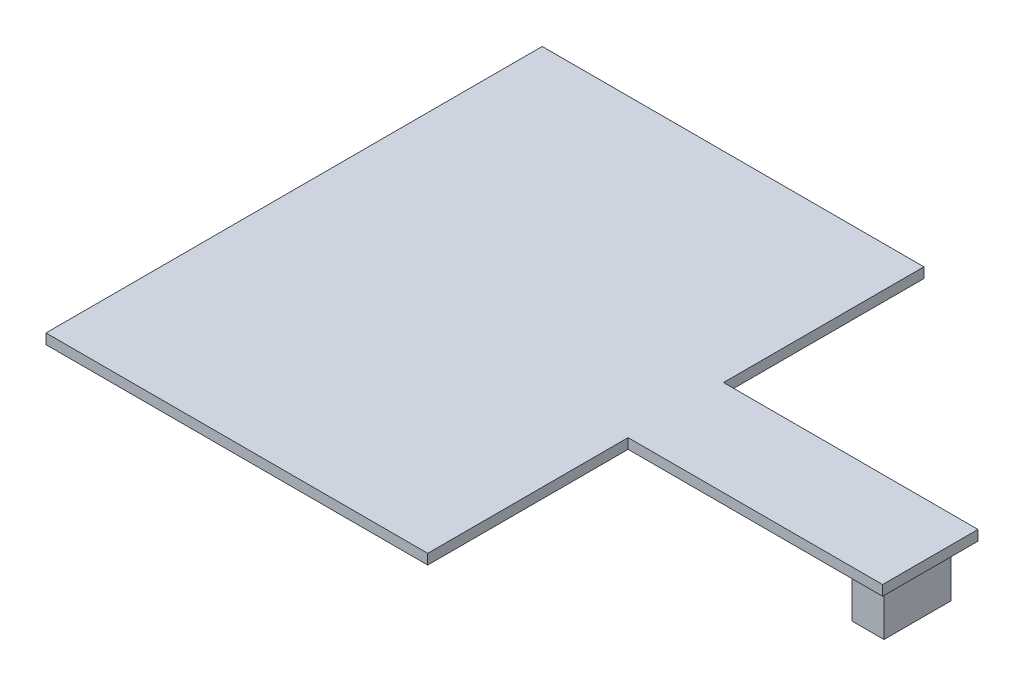
ISO-10303-21;
HEADER;
FILE_DESCRIPTION(('STEP AP214'),'2;1');
FILE_NAME('part.step','',(''),(''),'','','');
FILE_SCHEMA(('AUTOMOTIVE_DESIGN { 1 0 10303 214 1 1 1 1 }'));
ENDSEC;
DATA;
#1=APPLICATION_CONTEXT('core data for automotive mechanical design processes');
#2=APPLICATION_PROTOCOL_DEFINITION('international standard','automotive_design',2000,#1);
#3=PRODUCT_CONTEXT('',#1,'mechanical');
#4=PRODUCT('Part','Part','',(#3));
#5=PRODUCT_RELATED_PRODUCT_CATEGORY('part','',(#4));
#6=PRODUCT_DEFINITION_FORMATION('','',#4);
#7=PRODUCT_DEFINITION_CONTEXT('part definition',#1,'design');
#8=PRODUCT_DEFINITION('design','',#6,#7);
#9=PRODUCT_DEFINITION_SHAPE('','',#8);
#10=(LENGTH_UNIT() NAMED_UNIT(*) SI_UNIT(.MILLI.,.METRE.));
#11=(NAMED_UNIT(*) PLANE_ANGLE_UNIT() SI_UNIT($,.RADIAN.));
#12=(NAMED_UNIT(*) SI_UNIT($,.STERADIAN.) SOLID_ANGLE_UNIT());
#13=UNCERTAINTY_MEASURE_WITH_UNIT(LENGTH_MEASURE(1.E-05),#10,'distance_accuracy_value','');
#14=(GEOMETRIC_REPRESENTATION_CONTEXT(3) GLOBAL_UNCERTAINTY_ASSIGNED_CONTEXT((#13)) GLOBAL_UNIT_ASSIGNED_CONTEXT((#10,
#11,#12)) REPRESENTATION_CONTEXT('',''));
#15=CARTESIAN_POINT('',(0.,0.,0.));
#16=DIRECTION('',(0.,0.,1.));
#17=DIRECTION('',(1.,0.,0.));
#18=AXIS2_PLACEMENT_3D('',#15,#16,#17);
#19=CARTESIAN_POINT('',(0.,-1.6,0.));
#20=DIRECTION('',(0.,1.,0.));
#21=DIRECTION('',(0.,0.,1.));
#22=AXIS2_PLACEMENT_3D('',#19,#20,#21);
#23=PLANE('',#22);
#24=DIRECTION('',(1.,0.,0.));
#25=VECTOR('',#24,1.);
#26=CARTESIAN_POINT('',(0.,-1.6,39.));
#27=LINE('',#26,#25);
#28=CARTESIAN_POINT('',(-30.,-1.6,39.));
#29=VERTEX_POINT('',#28);
#30=CARTESIAN_POINT('',(30.,-1.6,39.));
#31=VERTEX_POINT('',#30);
#32=EDGE_CURVE('E155',#29,#31,#27,.T.);
#33=ORIENTED_EDGE('',*,*,#32,.F.);
#34=DIRECTION('',(0.,0.,-1.));
#35=VECTOR('',#34,1.);
#36=CARTESIAN_POINT('',(-30.,-1.6,0.));
#37=LINE('',#36,#35);
#38=CARTESIAN_POINT('',(-30.,-1.6,-39.));
#39=VERTEX_POINT('',#38);
#40=EDGE_CURVE('E173',#29,#39,#37,.T.);
#41=ORIENTED_EDGE('',*,*,#40,.T.);
#42=DIRECTION('',(1.,0.,0.));
#43=VECTOR('',#42,1.);
#44=CARTESIAN_POINT('',(0.,-1.6,-39.));
#45=LINE('',#44,#43);
#46=CARTESIAN_POINT('',(30.,-1.6,-39.));
#47=VERTEX_POINT('',#46);
#48=EDGE_CURVE('E171',#39,#47,#45,.T.);
#49=ORIENTED_EDGE('',*,*,#48,.T.);
#50=DIRECTION('',(0.,0.,-1.));
#51=VECTOR('',#50,1.);
#52=CARTESIAN_POINT('',(30.,-1.6,0.));
#53=LINE('',#52,#51);
#54=CARTESIAN_POINT('',(30.,-1.6,-7.5));
#55=VERTEX_POINT('',#54);
#56=EDGE_CURVE('E163',#55,#47,#53,.T.);
#57=ORIENTED_EDGE('',*,*,#56,.F.);
#58=DIRECTION('',(-1.,0.,0.));
#59=VECTOR('',#58,1.);
#60=CARTESIAN_POINT('',(0.,-1.6,-7.49999999999999));
#61=LINE('',#60,#59);
#62=CARTESIAN_POINT('',(70.,-1.6,-7.5));
#63=VERTEX_POINT('',#62);
#64=EDGE_CURVE('E168',#63,#55,#61,.T.);
#65=ORIENTED_EDGE('',*,*,#64,.F.);
#66=DIRECTION('',(0.,0.,-1.));
#67=VECTOR('',#66,1.);
#68=CARTESIAN_POINT('',(70.,-1.6,0.));
#69=LINE('',#68,#67);
#70=CARTESIAN_POINT('',(70.,-1.6,7.5));
#71=VERTEX_POINT('',#70);
#72=EDGE_CURVE('E165',#71,#63,#69,.T.);
#73=ORIENTED_EDGE('',*,*,#72,.F.);
#74=DIRECTION('',(-1.,0.,0.));
#75=VECTOR('',#74,1.);
#76=CARTESIAN_POINT('',(0.,-1.6,7.50000000000001));
#77=LINE('',#76,#75);
#78=CARTESIAN_POINT('',(30.,-1.6,7.5));
#79=VERTEX_POINT('',#78);
#80=EDGE_CURVE('E162',#71,#79,#77,.T.);
#81=ORIENTED_EDGE('',*,*,#80,.T.);
#82=EDGE_CURVE('E158',#31,#79,#53,.T.);
#83=ORIENTED_EDGE('',*,*,#82,.F.);
#84=EDGE_LOOP('',(#33,#41,#49,#57,#65,#73,#81,#83));
#85=FACE_BOUND('',#84,.T.);
#86=DIRECTION('',(0.,0.,1.));
#87=VECTOR('',#86,1.);
#88=CARTESIAN_POINT('',(68.,-1.6,-5.27999999999999));
#89=LINE('',#88,#87);
#90=CARTESIAN_POINT('',(68.,-1.6,-5.27999999999999));
#91=VERTEX_POINT('',#90);
#92=CARTESIAN_POINT('',(68.,-1.6,5.28000000000001));
#93=VERTEX_POINT('',#92);
#94=EDGE_CURVE('E145',#91,#93,#89,.T.);
#95=ORIENTED_EDGE('',*,*,#94,.F.);
#96=DIRECTION('',(1.,0.,0.));
#97=VECTOR('',#96,1.);
#98=CARTESIAN_POINT('',(63.,-1.6,-5.27999999999999));
#99=LINE('',#98,#97);
#100=CARTESIAN_POINT('',(63.,-1.6,-5.27999999999999));
#101=VERTEX_POINT('',#100);
#102=EDGE_CURVE('E142',#101,#91,#99,.T.);
#103=ORIENTED_EDGE('',*,*,#102,.F.);
#104=DIRECTION('',(0.,0.,-1.));
#105=VECTOR('',#104,1.);
#106=CARTESIAN_POINT('',(63.,-1.6,-5.27999999999999));
#107=LINE('',#106,#105);
#108=CARTESIAN_POINT('',(63.,-1.6,5.28000000000001));
#109=VERTEX_POINT('',#108);
#110=EDGE_CURVE('E57',#109,#101,#107,.T.);
#111=ORIENTED_EDGE('',*,*,#110,.F.);
#112=DIRECTION('',(-1.,0.,0.));
#113=VECTOR('',#112,1.);
#114=CARTESIAN_POINT('',(63.,-1.6,5.28000000000001));
#115=LINE('',#114,#113);
#116=EDGE_CURVE('E52',#93,#109,#115,.T.);
#117=ORIENTED_EDGE('',*,*,#116,.F.);
#118=EDGE_LOOP('',(#95,#103,#111,#117));
#119=FACE_BOUND('',#118,.T.);
#120=ADVANCED_FACE('F35',(#85,#119),#23,.F.);
#121=CARTESIAN_POINT('',(0.,-1.6,39.));
#122=DIRECTION('',(0.,0.,1.));
#123=DIRECTION('',(1.,0.,0.));
#124=AXIS2_PLACEMENT_3D('',#121,#122,#123);
#125=PLANE('',#124);
#126=DIRECTION('',(1.,0.,0.));
#127=VECTOR('',#126,1.);
#128=CARTESIAN_POINT('',(0.,0.,39.));
#129=LINE('',#128,#127);
#130=CARTESIAN_POINT('',(-30.,0.,39.));
#131=VERTEX_POINT('',#130);
#132=CARTESIAN_POINT('',(30.,0.,39.));
#133=VERTEX_POINT('',#132);
#134=EDGE_CURVE('E146',#131,#133,#129,.T.);
#135=ORIENTED_EDGE('',*,*,#134,.F.);
#136=DIRECTION('',(0.,1.,0.));
#137=VECTOR('',#136,1.);
#138=CARTESIAN_POINT('',(-30.,-1.6,39.));
#139=LINE('',#138,#137);
#140=EDGE_CURVE('E11',#29,#131,#139,.T.);
#141=ORIENTED_EDGE('',*,*,#140,.F.);
#142=ORIENTED_EDGE('',*,*,#32,.T.);
#143=DIRECTION('',(0.,1.,0.));
#144=VECTOR('',#143,1.);
#145=CARTESIAN_POINT('',(30.,-1.6,39.));
#146=LINE('',#145,#144);
#147=EDGE_CURVE('E39',#31,#133,#146,.T.);
#148=ORIENTED_EDGE('',*,*,#147,.T.);
#149=EDGE_LOOP('',(#135,#141,#142,#148));
#150=FACE_BOUND('',#149,.T.);
#151=ADVANCED_FACE('F37',(#150),#125,.T.);
#152=CARTESIAN_POINT('',(-30.,-1.6,0.));
#153=DIRECTION('',(1.,0.,0.));
#154=DIRECTION('',(0.,0.,-1.));
#155=AXIS2_PLACEMENT_3D('',#152,#153,#154);
#156=PLANE('',#155);
#157=DIRECTION('',(0.,0.,-1.));
#158=VECTOR('',#157,1.);
#159=CARTESIAN_POINT('',(-30.,0.,0.));
#160=LINE('',#159,#158);
#161=CARTESIAN_POINT('',(-30.,0.,-39.));
#162=VERTEX_POINT('',#161);
#163=EDGE_CURVE('E159',#131,#162,#160,.T.);
#164=ORIENTED_EDGE('',*,*,#163,.T.);
#165=DIRECTION('',(0.,1.,0.));
#166=VECTOR('',#165,1.);
#167=CARTESIAN_POINT('',(-30.,-1.6,-39.));
#168=LINE('',#167,#166);
#169=EDGE_CURVE('E44',#39,#162,#168,.T.);
#170=ORIENTED_EDGE('',*,*,#169,.F.);
#171=ORIENTED_EDGE('',*,*,#40,.F.);
#172=ORIENTED_EDGE('',*,*,#140,.T.);
#173=EDGE_LOOP('',(#164,#170,#171,#172));
#174=FACE_BOUND('',#173,.T.);
#175=ADVANCED_FACE('F217',(#174),#156,.F.);
#176=CARTESIAN_POINT('',(0.,-1.6,-39.));
#177=DIRECTION('',(0.,0.,1.));
#178=DIRECTION('',(1.,0.,0.));
#179=AXIS2_PLACEMENT_3D('',#176,#177,#178);
#180=PLANE('',#179);
#181=DIRECTION('',(1.,0.,0.));
#182=VECTOR('',#181,1.);
#183=CARTESIAN_POINT('',(0.,0.,-39.));
#184=LINE('',#183,#182);
#185=CARTESIAN_POINT('',(30.,0.,-39.));
#186=VERTEX_POINT('',#185);
#187=EDGE_CURVE('E187',#162,#186,#184,.T.);
#188=ORIENTED_EDGE('',*,*,#187,.T.);
#189=DIRECTION('',(0.,1.,0.));
#190=VECTOR('',#189,1.);
#191=CARTESIAN_POINT('',(30.,-1.6,-39.));
#192=LINE('',#191,#190);
#193=EDGE_CURVE('E193',#47,#186,#192,.T.);
#194=ORIENTED_EDGE('',*,*,#193,.F.);
#195=ORIENTED_EDGE('',*,*,#48,.F.);
#196=ORIENTED_EDGE('',*,*,#169,.T.);
#197=EDGE_LOOP('',(#188,#194,#195,#196));
#198=FACE_BOUND('',#197,.T.);
#199=ADVANCED_FACE('F221',(#198),#180,.F.);
#200=CARTESIAN_POINT('',(30.,-1.6,0.));
#201=DIRECTION('',(1.,0.,0.));
#202=DIRECTION('',(0.,0.,-1.));
#203=AXIS2_PLACEMENT_3D('',#200,#201,#202);
#204=PLANE('',#203);
#205=DIRECTION('',(0.,0.,-1.));
#206=VECTOR('',#205,1.);
#207=CARTESIAN_POINT('',(30.,0.,0.));
#208=LINE('',#207,#206);
#209=CARTESIAN_POINT('',(30.,0.,-7.5));
#210=VERTEX_POINT('',#209);
#211=EDGE_CURVE('E178',#210,#186,#208,.T.);
#212=ORIENTED_EDGE('',*,*,#211,.F.);
#213=DIRECTION('',(0.,1.,0.));
#214=VECTOR('',#213,1.);
#215=CARTESIAN_POINT('',(30.,-1.6,-7.5));
#216=LINE('',#215,#214);
#217=EDGE_CURVE('E195',#55,#210,#216,.T.);
#218=ORIENTED_EDGE('',*,*,#217,.F.);
#219=ORIENTED_EDGE('',*,*,#56,.T.);
#220=ORIENTED_EDGE('',*,*,#193,.T.);
#221=EDGE_LOOP('',(#212,#218,#219,#220));
#222=FACE_BOUND('',#221,.T.);
#223=ADVANCED_FACE('F239',(#222),#204,.T.);
#224=CARTESIAN_POINT('',(0.,-1.6,-7.49999999999999));
#225=DIRECTION('',(0.,0.,-1.));
#226=DIRECTION('',(-1.,0.,0.));
#227=AXIS2_PLACEMENT_3D('',#224,#225,#226);
#228=PLANE('',#227);
#229=DIRECTION('',(-1.,0.,0.));
#230=VECTOR('',#229,1.);
#231=CARTESIAN_POINT('',(0.,0.,-7.49999999999999));
#232=LINE('',#231,#230);
#233=CARTESIAN_POINT('',(70.,0.,-7.5));
#234=VERTEX_POINT('',#233);
#235=EDGE_CURVE('E184',#234,#210,#232,.T.);
#236=ORIENTED_EDGE('',*,*,#235,.F.);
#237=DIRECTION('',(0.,1.,0.));
#238=VECTOR('',#237,1.);
#239=CARTESIAN_POINT('',(70.,-1.6,-7.5));
#240=LINE('',#239,#238);
#241=EDGE_CURVE('E197',#63,#234,#240,.T.);
#242=ORIENTED_EDGE('',*,*,#241,.F.);
#243=ORIENTED_EDGE('',*,*,#64,.T.);
#244=ORIENTED_EDGE('',*,*,#217,.T.);
#245=EDGE_LOOP('',(#236,#242,#243,#244));
#246=FACE_BOUND('',#245,.T.);
#247=ADVANCED_FACE('F236',(#246),#228,.T.);
#248=CARTESIAN_POINT('',(70.,-1.6,0.));
#249=DIRECTION('',(1.,0.,0.));
#250=DIRECTION('',(0.,0.,-1.));
#251=AXIS2_PLACEMENT_3D('',#248,#249,#250);
#252=PLANE('',#251);
#253=DIRECTION('',(0.,0.,-1.));
#254=VECTOR('',#253,1.);
#255=CARTESIAN_POINT('',(70.,0.,0.));
#256=LINE('',#255,#254);
#257=CARTESIAN_POINT('',(70.,0.,7.5));
#258=VERTEX_POINT('',#257);
#259=EDGE_CURVE('E181',#258,#234,#256,.T.);
#260=ORIENTED_EDGE('',*,*,#259,.F.);
#261=DIRECTION('',(0.,1.,0.));
#262=VECTOR('',#261,1.);
#263=CARTESIAN_POINT('',(70.,-1.6,7.5));
#264=LINE('',#263,#262);
#265=EDGE_CURVE('E199',#71,#258,#264,.T.);
#266=ORIENTED_EDGE('',*,*,#265,.F.);
#267=ORIENTED_EDGE('',*,*,#72,.T.);
#268=ORIENTED_EDGE('',*,*,#241,.T.);
#269=EDGE_LOOP('',(#260,#266,#267,#268));
#270=FACE_BOUND('',#269,.T.);
#271=ADVANCED_FACE('F233',(#270),#252,.T.);
#272=CARTESIAN_POINT('',(0.,-1.6,7.50000000000001));
#273=DIRECTION('',(0.,0.,-1.));
#274=DIRECTION('',(-1.,0.,0.));
#275=AXIS2_PLACEMENT_3D('',#272,#273,#274);
#276=PLANE('',#275);
#277=DIRECTION('',(-1.,0.,0.));
#278=VECTOR('',#277,1.);
#279=CARTESIAN_POINT('',(0.,0.,7.50000000000001));
#280=LINE('',#279,#278);
#281=CARTESIAN_POINT('',(30.,0.,7.5));
#282=VERTEX_POINT('',#281);
#283=EDGE_CURVE('E177',#258,#282,#280,.T.);
#284=ORIENTED_EDGE('',*,*,#283,.T.);
#285=DIRECTION('',(0.,1.,0.));
#286=VECTOR('',#285,1.);
#287=CARTESIAN_POINT('',(30.,-1.6,7.5));
#288=LINE('',#287,#286);
#289=EDGE_CURVE('E200',#79,#282,#288,.T.);
#290=ORIENTED_EDGE('',*,*,#289,.F.);
#291=ORIENTED_EDGE('',*,*,#80,.F.);
#292=ORIENTED_EDGE('',*,*,#265,.T.);
#293=EDGE_LOOP('',(#284,#290,#291,#292));
#294=FACE_BOUND('',#293,.T.);
#295=ADVANCED_FACE('F230',(#294),#276,.F.);
#296=EDGE_CURVE('E149',#133,#282,#208,.T.);
#297=ORIENTED_EDGE('',*,*,#296,.F.);
#298=ORIENTED_EDGE('',*,*,#147,.F.);
#299=ORIENTED_EDGE('',*,*,#82,.T.);
#300=ORIENTED_EDGE('',*,*,#289,.T.);
#301=EDGE_LOOP('',(#297,#298,#299,#300));
#302=FACE_BOUND('',#301,.T.);
#303=ADVANCED_FACE('F208',(#302),#204,.T.);
#304=CARTESIAN_POINT('',(0.,0.,0.));
#305=DIRECTION('',(0.,1.,0.));
#306=DIRECTION('',(0.,0.,1.));
#307=AXIS2_PLACEMENT_3D('',#304,#305,#306);
#308=PLANE('',#307);
#309=ORIENTED_EDGE('',*,*,#134,.T.);
#310=ORIENTED_EDGE('',*,*,#296,.T.);
#311=ORIENTED_EDGE('',*,*,#283,.F.);
#312=ORIENTED_EDGE('',*,*,#259,.T.);
#313=ORIENTED_EDGE('',*,*,#235,.T.);
#314=ORIENTED_EDGE('',*,*,#211,.T.);
#315=ORIENTED_EDGE('',*,*,#187,.F.);
#316=ORIENTED_EDGE('',*,*,#163,.F.);
#317=EDGE_LOOP('',(#309,#310,#311,#312,#313,#314,#315,#316));
#318=FACE_BOUND('',#317,.T.);
#319=ADVANCED_FACE('F212',(#318),#308,.T.);
#320=CARTESIAN_POINT('',(68.,-9.6,-5.27999999999999));
#321=DIRECTION('',(-1.,0.,0.));
#322=DIRECTION('',(0.,0.,1.));
#323=AXIS2_PLACEMENT_3D('',#320,#321,#322);
#324=PLANE('',#323);
#325=ORIENTED_EDGE('',*,*,#94,.T.);
#326=DIRECTION('',(0.,1.,0.));
#327=VECTOR('',#326,1.);
#328=CARTESIAN_POINT('',(68.,-9.6,5.28000000000001));
#329=LINE('',#328,#327);
#330=CARTESIAN_POINT('',(68.,-9.6,5.28000000000001));
#331=VERTEX_POINT('',#330);
#332=EDGE_CURVE('E126',#331,#93,#329,.T.);
#333=ORIENTED_EDGE('',*,*,#332,.F.);
#334=DIRECTION('',(0.,0.,1.));
#335=VECTOR('',#334,1.);
#336=CARTESIAN_POINT('',(68.,-9.6,-5.27999999999999));
#337=LINE('',#336,#335);
#338=CARTESIAN_POINT('',(68.,-9.6,-5.27999999999999));
#339=VERTEX_POINT('',#338);
#340=EDGE_CURVE('E133',#339,#331,#337,.T.);
#341=ORIENTED_EDGE('',*,*,#340,.F.);
#342=DIRECTION('',(0.,1.,0.));
#343=VECTOR('',#342,1.);
#344=CARTESIAN_POINT('',(68.,-9.6,-5.27999999999999));
#345=LINE('',#344,#343);
#346=EDGE_CURVE('E361',#339,#91,#345,.T.);
#347=ORIENTED_EDGE('',*,*,#346,.T.);
#348=EDGE_LOOP('',(#325,#333,#341,#347));
#349=FACE_BOUND('',#348,.T.);
#350=ADVANCED_FACE('F144',(#349),#324,.F.);
#351=CARTESIAN_POINT('',(63.,-9.6,5.28000000000001));
#352=DIRECTION('',(0.,0.,-1.));
#353=DIRECTION('',(-1.,0.,0.));
#354=AXIS2_PLACEMENT_3D('',#351,#352,#353);
#355=PLANE('',#354);
#356=ORIENTED_EDGE('',*,*,#116,.T.);
#357=DIRECTION('',(0.,1.,0.));
#358=VECTOR('',#357,1.);
#359=CARTESIAN_POINT('',(63.,-9.6,5.28000000000001));
#360=LINE('',#359,#358);
#361=CARTESIAN_POINT('',(63.,-9.6,5.28000000000001));
#362=VERTEX_POINT('',#361);
#363=EDGE_CURVE('E129',#362,#109,#360,.T.);
#364=ORIENTED_EDGE('',*,*,#363,.F.);
#365=DIRECTION('',(-1.,0.,0.));
#366=VECTOR('',#365,1.);
#367=CARTESIAN_POINT('',(63.,-9.6,5.28000000000001));
#368=LINE('',#367,#366);
#369=EDGE_CURVE('E122',#331,#362,#368,.T.);
#370=ORIENTED_EDGE('',*,*,#369,.F.);
#371=ORIENTED_EDGE('',*,*,#332,.T.);
#372=EDGE_LOOP('',(#356,#364,#370,#371));
#373=FACE_BOUND('',#372,.T.);
#374=ADVANCED_FACE('F124',(#373),#355,.F.);
#375=CARTESIAN_POINT('',(63.,-9.6,-5.27999999999999));
#376=DIRECTION('',(1.,0.,0.));
#377=DIRECTION('',(0.,0.,-1.));
#378=AXIS2_PLACEMENT_3D('',#375,#376,#377);
#379=PLANE('',#378);
#380=ORIENTED_EDGE('',*,*,#110,.T.);
#381=DIRECTION('',(0.,1.,0.));
#382=VECTOR('',#381,1.);
#383=CARTESIAN_POINT('',(63.,-9.6,-5.27999999999999));
#384=LINE('',#383,#382);
#385=CARTESIAN_POINT('',(63.,-9.6,-5.27999999999999));
#386=VERTEX_POINT('',#385);
#387=EDGE_CURVE('E151',#386,#101,#384,.T.);
#388=ORIENTED_EDGE('',*,*,#387,.F.);
#389=DIRECTION('',(0.,0.,-1.));
#390=VECTOR('',#389,1.);
#391=CARTESIAN_POINT('',(63.,-9.6,-5.27999999999999));
#392=LINE('',#391,#390);
#393=EDGE_CURVE('E132',#362,#386,#392,.T.);
#394=ORIENTED_EDGE('',*,*,#393,.F.);
#395=ORIENTED_EDGE('',*,*,#363,.T.);
#396=EDGE_LOOP('',(#380,#388,#394,#395));
#397=FACE_BOUND('',#396,.T.);
#398=ADVANCED_FACE('F329',(#397),#379,.F.);
#399=CARTESIAN_POINT('',(63.,-9.6,-5.27999999999999));
#400=DIRECTION('',(0.,0.,1.));
#401=DIRECTION('',(1.,0.,0.));
#402=AXIS2_PLACEMENT_3D('',#399,#400,#401);
#403=PLANE('',#402);
#404=ORIENTED_EDGE('',*,*,#102,.T.);
#405=ORIENTED_EDGE('',*,*,#346,.F.);
#406=DIRECTION('',(1.,0.,0.));
#407=VECTOR('',#406,1.);
#408=CARTESIAN_POINT('',(63.,-9.6,-5.27999999999999));
#409=LINE('',#408,#407);
#410=EDGE_CURVE('E138',#386,#339,#409,.T.);
#411=ORIENTED_EDGE('',*,*,#410,.F.);
#412=ORIENTED_EDGE('',*,*,#387,.T.);
#413=EDGE_LOOP('',(#404,#405,#411,#412));
#414=FACE_BOUND('',#413,.T.);
#415=ADVANCED_FACE('F337',(#414),#403,.F.);
#416=CARTESIAN_POINT('',(0.,-9.6,0.));
#417=DIRECTION('',(0.,1.,0.));
#418=DIRECTION('',(0.,0.,1.));
#419=AXIS2_PLACEMENT_3D('',#416,#417,#418);
#420=PLANE('',#419);
#421=ORIENTED_EDGE('',*,*,#340,.T.);
#422=ORIENTED_EDGE('',*,*,#369,.T.);
#423=ORIENTED_EDGE('',*,*,#393,.T.);
#424=ORIENTED_EDGE('',*,*,#410,.T.);
#425=EDGE_LOOP('',(#421,#422,#423,#424));
#426=FACE_BOUND('',#425,.T.);
#427=ADVANCED_FACE('F136',(#426),#420,.F.);
#428=CLOSED_SHELL('',(#120,#151,#175,#199,#223,#247,#271,#295,#303,#319,#350,#374,#398,#415,#427));
#429=MANIFOLD_SOLID_BREP('B2',#428);
#430=ADVANCED_BREP_SHAPE_REPRESENTATION('',(#18,#429),#14);
#431=SHAPE_DEFINITION_REPRESENTATION(#9,#430);
ENDSEC;
END-ISO-10303-21;
